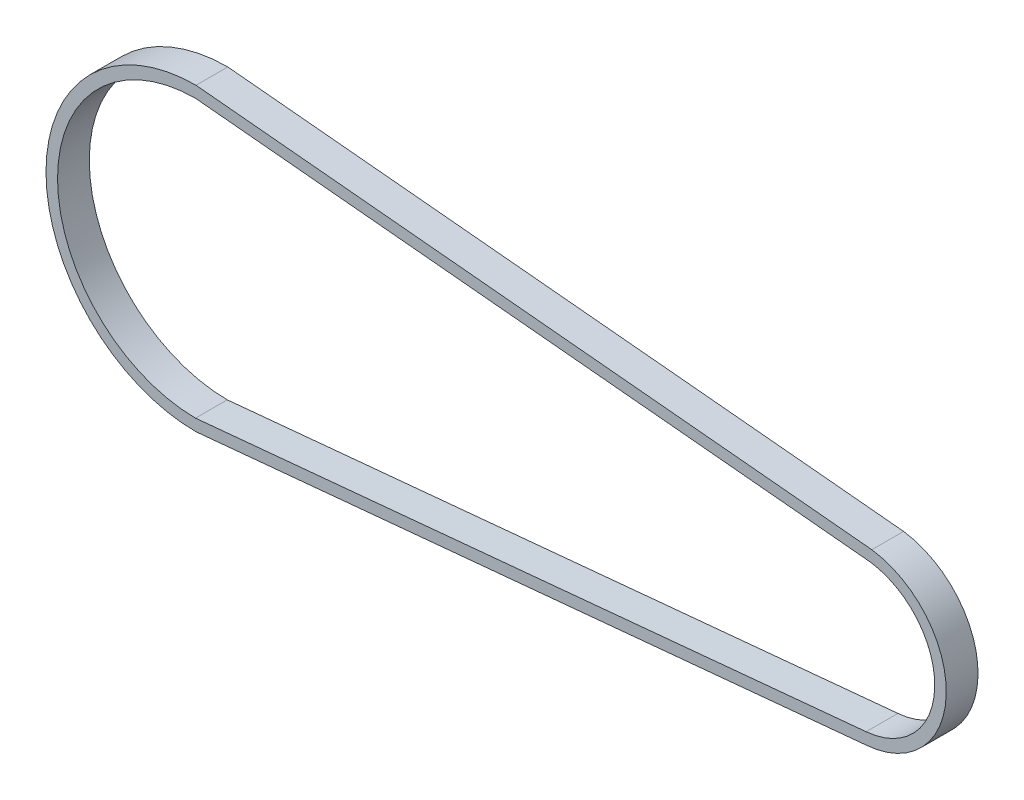
ISO-10303-21;
HEADER;
FILE_DESCRIPTION(('STEP AP214'),'2;1');
FILE_NAME('part.step','',(''),(''),'','','');
FILE_SCHEMA(('AUTOMOTIVE_DESIGN { 1 0 10303 214 1 1 1 1 }'));
ENDSEC;
DATA;
#1=APPLICATION_CONTEXT('core data for automotive mechanical design processes');
#2=APPLICATION_PROTOCOL_DEFINITION('international standard','automotive_design',2000,#1);
#3=PRODUCT_CONTEXT('',#1,'mechanical');
#4=PRODUCT('Part','Part','',(#3));
#5=PRODUCT_RELATED_PRODUCT_CATEGORY('part','',(#4));
#6=PRODUCT_DEFINITION_FORMATION('','',#4);
#7=PRODUCT_DEFINITION_CONTEXT('part definition',#1,'design');
#8=PRODUCT_DEFINITION('design','',#6,#7);
#9=PRODUCT_DEFINITION_SHAPE('','',#8);
#10=(LENGTH_UNIT() NAMED_UNIT(*) SI_UNIT(.MILLI.,.METRE.));
#11=(NAMED_UNIT(*) PLANE_ANGLE_UNIT() SI_UNIT($,.RADIAN.));
#12=(NAMED_UNIT(*) SI_UNIT($,.STERADIAN.) SOLID_ANGLE_UNIT());
#13=UNCERTAINTY_MEASURE_WITH_UNIT(LENGTH_MEASURE(1.E-05),#10,'distance_accuracy_value','');
#14=(GEOMETRIC_REPRESENTATION_CONTEXT(3) GLOBAL_UNCERTAINTY_ASSIGNED_CONTEXT((#13)) GLOBAL_UNIT_ASSIGNED_CONTEXT((#10,
#11,#12)) REPRESENTATION_CONTEXT('',''));
#15=CARTESIAN_POINT('',(0.,0.,0.));
#16=DIRECTION('',(0.,0.,1.));
#17=DIRECTION('',(1.,0.,0.));
#18=AXIS2_PLACEMENT_3D('',#15,#16,#17);
#19=CARTESIAN_POINT('',(0.,0.,5.5));
#20=DIRECTION('',(0.,0.,1.));
#21=DIRECTION('',(1.,0.,0.));
#22=AXIS2_PLACEMENT_3D('',#19,#20,#21);
#23=PLANE('',#22);
#24=CARTESIAN_POINT('',(0.,0.,5.5));
#25=DIRECTION('',(0.,0.,1.));
#26=DIRECTION('',(1.,0.,0.));
#27=AXIS2_PLACEMENT_3D('',#24,#25,#26);
#28=CIRCLE('',#27,26.);
#29=CARTESIAN_POINT('',(0.,26.,5.5));
#30=VERTEX_POINT('',#29);
#31=CARTESIAN_POINT('',(0.,-26.,5.5));
#32=VERTEX_POINT('',#31);
#33=EDGE_CURVE('E137',#30,#32,#28,.T.);
#34=ORIENTED_EDGE('',*,*,#33,.T.);
#35=DIRECTION('',(0.99551139389757,0.0946417699544854,0.));
#36=VECTOR('',#35,1.);
#37=CARTESIAN_POINT('',(0.,-26.,5.5));
#38=LINE('',#37,#36);
#39=CARTESIAN_POINT('',(116.296767587666,-14.9438413342613,5.5));
#40=VERTEX_POINT('',#39);
#41=EDGE_CURVE('E140',#32,#40,#38,.T.);
#42=ORIENTED_EDGE('',*,*,#41,.T.);
#43=CARTESIAN_POINT('',(115.,0.,5.5));
#44=DIRECTION('',(0.,0.,1.));
#45=DIRECTION('',(1.,0.,0.));
#46=AXIS2_PLACEMENT_3D('',#43,#44,#45);
#47=CIRCLE('',#46,15.);
#48=CARTESIAN_POINT('',(117.09893142133,14.8524236031887,5.5));
#49=VERTEX_POINT('',#48);
#50=EDGE_CURVE('E143',#40,#49,#47,.T.);
#51=ORIENTED_EDGE('',*,*,#50,.T.);
#52=DIRECTION('',(-0.995499245202635,0.0947694718830116,0.));
#53=VECTOR('',#52,1.);
#54=CARTESIAN_POINT('',(0.,26.,5.5));
#55=LINE('',#54,#53);
#56=EDGE_CURVE('E145',#49,#30,#55,.T.);
#57=ORIENTED_EDGE('',*,*,#56,.T.);
#58=EDGE_LOOP('',(#34,#42,#51,#57));
#59=FACE_BOUND('',#58,.T.);
#60=DIRECTION('',(0.99551139389757,0.0946417699544854,0.));
#61=VECTOR('',#60,1.);
#62=CARTESIAN_POINT('',(-0.092960895040291,-23.9998199633246,5.5));
#63=LINE('',#62,#61);
#64=CARTESIAN_POINT('',(-0.092960895040291,-23.9998199633246,5.5));
#65=VERTEX_POINT('',#64);
#66=CARTESIAN_POINT('',(116.115964374061,-12.9520123346075,5.5));
#67=VERTEX_POINT('',#66);
#68=EDGE_CURVE('E109',#65,#67,#63,.T.);
#69=ORIENTED_EDGE('',*,*,#68,.F.);
#70=CARTESIAN_POINT('',(0.,0.,5.5));
#71=DIRECTION('',(0.,0.,1.));
#72=DIRECTION('',(1.,0.,0.));
#73=AXIS2_PLACEMENT_3D('',#70,#71,#72);
#74=CIRCLE('',#73,24.);
#75=CARTESIAN_POINT('',(-0.093086906771022,23.9998194749,5.5));
#76=VERTEX_POINT('',#75);
#77=EDGE_CURVE('E101',#76,#65,#74,.T.);
#78=ORIENTED_EDGE('',*,*,#77,.F.);
#79=DIRECTION('',(-0.995499245202635,0.0947694718830116,0.));
#80=VECTOR('',#79,1.);
#81=CARTESIAN_POINT('',(-0.093086906771022,23.9998194749,5.5));
#82=LINE('',#81,#80);
#83=CARTESIAN_POINT('',(116.862491660054,12.865889973734,5.5));
#84=VERTEX_POINT('',#83);
#85=EDGE_CURVE('E123',#84,#76,#82,.T.);
#86=ORIENTED_EDGE('',*,*,#85,.F.);
#87=CARTESIAN_POINT('',(115.,0.,5.5));
#88=DIRECTION('',(0.,0.,1.));
#89=DIRECTION('',(1.,0.,0.));
#90=AXIS2_PLACEMENT_3D('',#87,#88,#89);
#91=CIRCLE('',#90,13.);
#92=EDGE_CURVE('E121',#67,#84,#91,.T.);
#93=ORIENTED_EDGE('',*,*,#92,.F.);
#94=EDGE_LOOP('',(#69,#78,#86,#93));
#95=FACE_BOUND('',#94,.T.);
#96=ADVANCED_FACE('F36',(#59,#95),#23,.T.);
#97=CARTESIAN_POINT('',(0.,0.,0.));
#98=DIRECTION('',(0.,0.,1.));
#99=DIRECTION('',(1.,0.,0.));
#100=AXIS2_PLACEMENT_3D('',#97,#98,#99);
#101=PLANE('',#100);
#102=CARTESIAN_POINT('',(0.,0.,0.));
#103=DIRECTION('',(0.,0.,1.));
#104=DIRECTION('',(1.,0.,0.));
#105=AXIS2_PLACEMENT_3D('',#102,#103,#104);
#106=CIRCLE('',#105,26.);
#107=CARTESIAN_POINT('',(0.,26.,0.));
#108=VERTEX_POINT('',#107);
#109=CARTESIAN_POINT('',(0.,-26.,0.));
#110=VERTEX_POINT('',#109);
#111=EDGE_CURVE('E117',#108,#110,#106,.T.);
#112=ORIENTED_EDGE('',*,*,#111,.F.);
#113=DIRECTION('',(-0.995499245202635,0.0947694718830116,0.));
#114=VECTOR('',#113,1.);
#115=CARTESIAN_POINT('',(0.,26.,0.));
#116=LINE('',#115,#114);
#117=CARTESIAN_POINT('',(117.09893142133,14.8524236031887,0.));
#118=VERTEX_POINT('',#117);
#119=EDGE_CURVE('E141',#118,#108,#116,.T.);
#120=ORIENTED_EDGE('',*,*,#119,.F.);
#121=CARTESIAN_POINT('',(115.,0.,0.));
#122=DIRECTION('',(0.,0.,1.));
#123=DIRECTION('',(1.,0.,0.));
#124=AXIS2_PLACEMENT_3D('',#121,#122,#123);
#125=CIRCLE('',#124,15.);
#126=CARTESIAN_POINT('',(116.296767587666,-14.9438413342613,0.));
#127=VERTEX_POINT('',#126);
#128=EDGE_CURVE('E152',#127,#118,#125,.T.);
#129=ORIENTED_EDGE('',*,*,#128,.F.);
#130=DIRECTION('',(0.99551139389757,0.0946417699544854,0.));
#131=VECTOR('',#130,1.);
#132=CARTESIAN_POINT('',(0.,-26.,0.));
#133=LINE('',#132,#131);
#134=EDGE_CURVE('E150',#110,#127,#133,.T.);
#135=ORIENTED_EDGE('',*,*,#134,.F.);
#136=EDGE_LOOP('',(#112,#120,#129,#135));
#137=FACE_BOUND('',#136,.T.);
#138=CARTESIAN_POINT('',(0.,0.,0.));
#139=DIRECTION('',(0.,0.,1.));
#140=DIRECTION('',(1.,0.,0.));
#141=AXIS2_PLACEMENT_3D('',#138,#139,#140);
#142=CIRCLE('',#141,24.);
#143=CARTESIAN_POINT('',(-0.093086906771022,23.9998194749,0.));
#144=VERTEX_POINT('',#143);
#145=CARTESIAN_POINT('',(-0.092960895040291,-23.9998199633246,0.));
#146=VERTEX_POINT('',#145);
#147=EDGE_CURVE('E59',#144,#146,#142,.T.);
#148=ORIENTED_EDGE('',*,*,#147,.T.);
#149=DIRECTION('',(0.99551139389757,0.0946417699544854,0.));
#150=VECTOR('',#149,1.);
#151=CARTESIAN_POINT('',(-0.092960895040291,-23.9998199633246,0.));
#152=LINE('',#151,#150);
#153=CARTESIAN_POINT('',(116.115964374061,-12.9520123346075,0.));
#154=VERTEX_POINT('',#153);
#155=EDGE_CURVE('E116',#146,#154,#152,.T.);
#156=ORIENTED_EDGE('',*,*,#155,.T.);
#157=CARTESIAN_POINT('',(115.,0.,0.));
#158=DIRECTION('',(0.,0.,1.));
#159=DIRECTION('',(1.,0.,0.));
#160=AXIS2_PLACEMENT_3D('',#157,#158,#159);
#161=CIRCLE('',#160,13.);
#162=CARTESIAN_POINT('',(116.862491660054,12.865889973734,0.));
#163=VERTEX_POINT('',#162);
#164=EDGE_CURVE('E129',#154,#163,#161,.T.);
#165=ORIENTED_EDGE('',*,*,#164,.T.);
#166=DIRECTION('',(-0.995499245202635,0.0947694718830116,0.));
#167=VECTOR('',#166,1.);
#168=CARTESIAN_POINT('',(-0.093086906771022,23.9998194749,0.));
#169=LINE('',#168,#167);
#170=EDGE_CURVE('E110',#163,#144,#169,.T.);
#171=ORIENTED_EDGE('',*,*,#170,.T.);
#172=EDGE_LOOP('',(#148,#156,#165,#171));
#173=FACE_BOUND('',#172,.T.);
#174=ADVANCED_FACE('F170',(#137,#173),#101,.F.);
#175=CARTESIAN_POINT('',(0.,0.,5.5));
#176=DIRECTION('',(0.,0.,-1.));
#177=DIRECTION('',(-1.,0.,0.));
#178=AXIS2_PLACEMENT_3D('',#175,#176,#177);
#179=CYLINDRICAL_SURFACE('',#178,26.);
#180=ORIENTED_EDGE('',*,*,#111,.T.);
#181=DIRECTION('',(0.,0.,-1.));
#182=VECTOR('',#181,1.);
#183=CARTESIAN_POINT('',(0.,-26.,5.5));
#184=LINE('',#183,#182);
#185=EDGE_CURVE('E11',#32,#110,#184,.T.);
#186=ORIENTED_EDGE('',*,*,#185,.F.);
#187=ORIENTED_EDGE('',*,*,#33,.F.);
#188=DIRECTION('',(0.,0.,-1.));
#189=VECTOR('',#188,1.);
#190=CARTESIAN_POINT('',(0.,26.,5.5));
#191=LINE('',#190,#189);
#192=EDGE_CURVE('E147',#30,#108,#191,.T.);
#193=ORIENTED_EDGE('',*,*,#192,.T.);
#194=EDGE_LOOP('',(#180,#186,#187,#193));
#195=FACE_BOUND('',#194,.T.);
#196=ADVANCED_FACE('F38',(#195),#179,.T.);
#197=CARTESIAN_POINT('',(0.,-26.,5.5));
#198=DIRECTION('',(-0.0946417699544854,0.99551139389757,0.));
#199=DIRECTION('',(-0.99551139389757,-0.0946417699544854,0.));
#200=AXIS2_PLACEMENT_3D('',#197,#198,#199);
#201=PLANE('',#200);
#202=ORIENTED_EDGE('',*,*,#134,.T.);
#203=DIRECTION('',(0.,0.,-1.));
#204=VECTOR('',#203,1.);
#205=CARTESIAN_POINT('',(116.296767587666,-14.9438413342613,5.5));
#206=LINE('',#205,#204);
#207=EDGE_CURVE('E44',#40,#127,#206,.T.);
#208=ORIENTED_EDGE('',*,*,#207,.F.);
#209=ORIENTED_EDGE('',*,*,#41,.F.);
#210=ORIENTED_EDGE('',*,*,#185,.T.);
#211=EDGE_LOOP('',(#202,#208,#209,#210));
#212=FACE_BOUND('',#211,.T.);
#213=ADVANCED_FACE('F180',(#212),#201,.F.);
#214=CARTESIAN_POINT('',(115.,0.,5.5));
#215=DIRECTION('',(0.,0.,-1.));
#216=DIRECTION('',(-1.,0.,0.));
#217=AXIS2_PLACEMENT_3D('',#214,#215,#216);
#218=CYLINDRICAL_SURFACE('',#217,15.);
#219=ORIENTED_EDGE('',*,*,#128,.T.);
#220=DIRECTION('',(0.,0.,-1.));
#221=VECTOR('',#220,1.);
#222=CARTESIAN_POINT('',(117.09893142133,14.8524236031887,5.5));
#223=LINE('',#222,#221);
#224=EDGE_CURVE('E157',#49,#118,#223,.T.);
#225=ORIENTED_EDGE('',*,*,#224,.F.);
#226=ORIENTED_EDGE('',*,*,#50,.F.);
#227=ORIENTED_EDGE('',*,*,#207,.T.);
#228=EDGE_LOOP('',(#219,#225,#226,#227));
#229=FACE_BOUND('',#228,.T.);
#230=ADVANCED_FACE('F164',(#229),#218,.T.);
#231=CARTESIAN_POINT('',(0.,26.,5.5));
#232=DIRECTION('',(-0.0947694718830116,-0.995499245202635,0.));
#233=DIRECTION('',(0.995499245202635,-0.0947694718830116,0.));
#234=AXIS2_PLACEMENT_3D('',#231,#232,#233);
#235=PLANE('',#234);
#236=ORIENTED_EDGE('',*,*,#119,.T.);
#237=ORIENTED_EDGE('',*,*,#192,.F.);
#238=ORIENTED_EDGE('',*,*,#56,.F.);
#239=ORIENTED_EDGE('',*,*,#224,.T.);
#240=EDGE_LOOP('',(#236,#237,#238,#239));
#241=FACE_BOUND('',#240,.T.);
#242=ADVANCED_FACE('F174',(#241),#235,.F.);
#243=CARTESIAN_POINT('',(0.,0.,5.5));
#244=DIRECTION('',(0.,0.,-1.));
#245=DIRECTION('',(-1.,0.,0.));
#246=AXIS2_PLACEMENT_3D('',#243,#244,#245);
#247=CYLINDRICAL_SURFACE('',#246,24.);
#248=ORIENTED_EDGE('',*,*,#147,.F.);
#249=DIRECTION('',(0.,0.,-1.));
#250=VECTOR('',#249,1.);
#251=CARTESIAN_POINT('',(-0.093086906771022,23.9998194749,5.5));
#252=LINE('',#251,#250);
#253=EDGE_CURVE('E105',#76,#144,#252,.T.);
#254=ORIENTED_EDGE('',*,*,#253,.F.);
#255=ORIENTED_EDGE('',*,*,#77,.T.);
#256=DIRECTION('',(0.,0.,-1.));
#257=VECTOR('',#256,1.);
#258=CARTESIAN_POINT('',(-0.092960895040291,-23.9998199633246,5.5));
#259=LINE('',#258,#257);
#260=EDGE_CURVE('E104',#65,#146,#259,.T.);
#261=ORIENTED_EDGE('',*,*,#260,.T.);
#262=EDGE_LOOP('',(#248,#254,#255,#261));
#263=FACE_BOUND('',#262,.T.);
#264=ADVANCED_FACE('F103',(#263),#247,.F.);
#265=CARTESIAN_POINT('',(-0.092960895040291,-23.9998199633246,5.5));
#266=DIRECTION('',(-0.0946417699544855,0.99551139389757,0.));
#267=DIRECTION('',(-0.99551139389757,-0.0946417699544854,0.));
#268=AXIS2_PLACEMENT_3D('',#265,#266,#267);
#269=PLANE('',#268);
#270=ORIENTED_EDGE('',*,*,#155,.F.);
#271=ORIENTED_EDGE('',*,*,#260,.F.);
#272=ORIENTED_EDGE('',*,*,#68,.T.);
#273=DIRECTION('',(0.,0.,-1.));
#274=VECTOR('',#273,1.);
#275=CARTESIAN_POINT('',(116.115964374061,-12.9520123346075,5.5));
#276=LINE('',#275,#274);
#277=EDGE_CURVE('E118',#67,#154,#276,.T.);
#278=ORIENTED_EDGE('',*,*,#277,.T.);
#279=EDGE_LOOP('',(#270,#271,#272,#278));
#280=FACE_BOUND('',#279,.T.);
#281=ADVANCED_FACE('F113',(#280),#269,.T.);
#282=CARTESIAN_POINT('',(115.,0.,5.5));
#283=DIRECTION('',(0.,0.,-1.));
#284=DIRECTION('',(-1.,0.,0.));
#285=AXIS2_PLACEMENT_3D('',#282,#283,#284);
#286=CYLINDRICAL_SURFACE('',#285,13.);
#287=ORIENTED_EDGE('',*,*,#164,.F.);
#288=ORIENTED_EDGE('',*,*,#277,.F.);
#289=ORIENTED_EDGE('',*,*,#92,.T.);
#290=DIRECTION('',(0.,0.,-1.));
#291=VECTOR('',#290,1.);
#292=CARTESIAN_POINT('',(116.862491660054,12.865889973734,5.5));
#293=LINE('',#292,#291);
#294=EDGE_CURVE('E51',#84,#163,#293,.T.);
#295=ORIENTED_EDGE('',*,*,#294,.T.);
#296=EDGE_LOOP('',(#287,#288,#289,#295));
#297=FACE_BOUND('',#296,.T.);
#298=ADVANCED_FACE('F203',(#297),#286,.F.);
#299=CARTESIAN_POINT('',(-0.093086906771022,23.9998194749,5.5));
#300=DIRECTION('',(-0.0947694718830116,-0.995499245202635,0.));
#301=DIRECTION('',(0.995499245202635,-0.0947694718830116,0.));
#302=AXIS2_PLACEMENT_3D('',#299,#300,#301);
#303=PLANE('',#302);
#304=ORIENTED_EDGE('',*,*,#170,.F.);
#305=ORIENTED_EDGE('',*,*,#294,.F.);
#306=ORIENTED_EDGE('',*,*,#85,.T.);
#307=ORIENTED_EDGE('',*,*,#253,.T.);
#308=EDGE_LOOP('',(#304,#305,#306,#307));
#309=FACE_BOUND('',#308,.T.);
#310=ADVANCED_FACE('F207',(#309),#303,.T.);
#311=CLOSED_SHELL('',(#96,#174,#196,#213,#230,#242,#264,#281,#298,#310));
#312=MANIFOLD_SOLID_BREP('B2',#311);
#313=ADVANCED_BREP_SHAPE_REPRESENTATION('',(#18,#312),#14);
#314=SHAPE_DEFINITION_REPRESENTATION(#9,#313);
ENDSEC;
END-ISO-10303-21;
